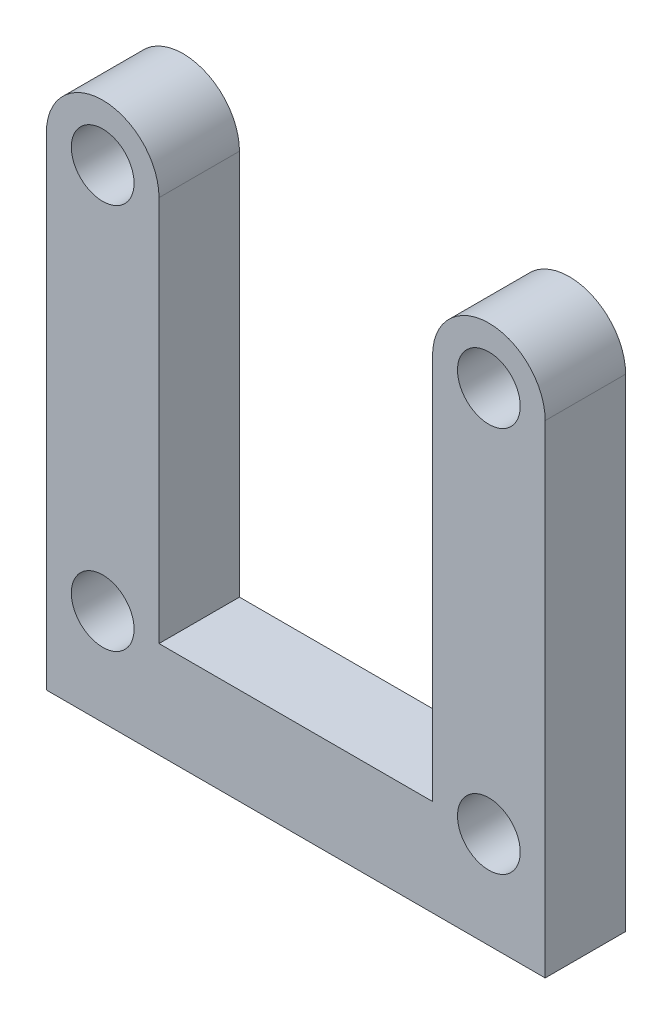
ISO-10303-21;
HEADER;
FILE_DESCRIPTION(('STEP AP214'),'2;1');
FILE_NAME('part.step','',(''),(''),'','','');
FILE_SCHEMA(('AUTOMOTIVE_DESIGN { 1 0 10303 214 1 1 1 1 }'));
ENDSEC;
DATA;
#1=APPLICATION_CONTEXT('core data for automotive mechanical design processes');
#2=APPLICATION_PROTOCOL_DEFINITION('international standard','automotive_design',2000,#1);
#3=PRODUCT_CONTEXT('',#1,'mechanical');
#4=PRODUCT('Part','Part','',(#3));
#5=PRODUCT_RELATED_PRODUCT_CATEGORY('part','',(#4));
#6=PRODUCT_DEFINITION_FORMATION('','',#4);
#7=PRODUCT_DEFINITION_CONTEXT('part definition',#1,'design');
#8=PRODUCT_DEFINITION('design','',#6,#7);
#9=PRODUCT_DEFINITION_SHAPE('','',#8);
#10=(LENGTH_UNIT() NAMED_UNIT(*) SI_UNIT(.MILLI.,.METRE.));
#11=(NAMED_UNIT(*) PLANE_ANGLE_UNIT() SI_UNIT($,.RADIAN.));
#12=(NAMED_UNIT(*) SI_UNIT($,.STERADIAN.) SOLID_ANGLE_UNIT());
#13=UNCERTAINTY_MEASURE_WITH_UNIT(LENGTH_MEASURE(1.E-05),#10,'distance_accuracy_value','');
#14=(GEOMETRIC_REPRESENTATION_CONTEXT(3) GLOBAL_UNCERTAINTY_ASSIGNED_CONTEXT((#13)) GLOBAL_UNIT_ASSIGNED_CONTEXT((#10,
#11,#12)) REPRESENTATION_CONTEXT('',''));
#15=CARTESIAN_POINT('',(0.,0.,0.));
#16=DIRECTION('',(0.,0.,1.));
#17=DIRECTION('',(1.,0.,0.));
#18=AXIS2_PLACEMENT_3D('',#15,#16,#17);
#19=CARTESIAN_POINT('',(15.5,0.,5.));
#20=DIRECTION('',(1.,0.,0.));
#21=DIRECTION('',(0.,1.,0.));
#22=AXIS2_PLACEMENT_3D('',#19,#20,#21);
#23=PLANE('',#22);
#24=DIRECTION('',(0.,-1.,0.));
#25=VECTOR('',#24,1.);
#26=CARTESIAN_POINT('',(15.5,0.,0.));
#27=LINE('',#26,#25);
#28=CARTESIAN_POINT('',(15.5,12.,0.));
#29=VERTEX_POINT('',#28);
#30=CARTESIAN_POINT('',(15.5,-18.,0.));
#31=VERTEX_POINT('',#30);
#32=EDGE_CURVE('E155',#29,#31,#27,.T.);
#33=ORIENTED_EDGE('',*,*,#32,.F.);
#34=DIRECTION('',(0.,0.,-1.));
#35=VECTOR('',#34,1.);
#36=CARTESIAN_POINT('',(15.5,12.,5.));
#37=LINE('',#36,#35);
#38=CARTESIAN_POINT('',(15.5,12.,5.));
#39=VERTEX_POINT('',#38);
#40=EDGE_CURVE('E11',#39,#29,#37,.T.);
#41=ORIENTED_EDGE('',*,*,#40,.F.);
#42=DIRECTION('',(0.,-1.,0.));
#43=VECTOR('',#42,1.);
#44=CARTESIAN_POINT('',(15.5,0.,5.));
#45=LINE('',#44,#43);
#46=CARTESIAN_POINT('',(15.5,-18.,5.));
#47=VERTEX_POINT('',#46);
#48=EDGE_CURVE('E272',#39,#47,#45,.T.);
#49=ORIENTED_EDGE('',*,*,#48,.T.);
#50=DIRECTION('',(0.,0.,-1.));
#51=VECTOR('',#50,1.);
#52=CARTESIAN_POINT('',(15.5,-18.,5.));
#53=LINE('',#52,#51);
#54=EDGE_CURVE('E57',#47,#31,#53,.T.);
#55=ORIENTED_EDGE('',*,*,#54,.T.);
#56=EDGE_LOOP('',(#33,#41,#49,#55));
#57=FACE_BOUND('',#56,.T.);
#58=ADVANCED_FACE('F40',(#57),#23,.T.);
#59=CARTESIAN_POINT('',(12.,12.,5.));
#60=DIRECTION('',(0.,0.,-1.));
#61=DIRECTION('',(-1.,0.,0.));
#62=AXIS2_PLACEMENT_3D('',#59,#60,#61);
#63=CYLINDRICAL_SURFACE('',#62,3.5);
#64=CARTESIAN_POINT('',(12.,12.,0.));
#65=DIRECTION('',(0.,0.,1.));
#66=DIRECTION('',(1.,0.,0.));
#67=AXIS2_PLACEMENT_3D('',#64,#65,#66);
#68=CIRCLE('',#67,3.5);
#69=CARTESIAN_POINT('',(8.5,12.,0.));
#70=VERTEX_POINT('',#69);
#71=EDGE_CURVE('E152',#29,#70,#68,.T.);
#72=ORIENTED_EDGE('',*,*,#71,.T.);
#73=DIRECTION('',(0.,0.,-1.));
#74=VECTOR('',#73,1.);
#75=CARTESIAN_POINT('',(8.5,12.,5.));
#76=LINE('',#75,#74);
#77=CARTESIAN_POINT('',(8.5,12.,5.));
#78=VERTEX_POINT('',#77);
#79=EDGE_CURVE('E49',#78,#70,#76,.T.);
#80=ORIENTED_EDGE('',*,*,#79,.F.);
#81=CARTESIAN_POINT('',(12.,12.,5.));
#82=DIRECTION('',(0.,0.,1.));
#83=DIRECTION('',(1.,0.,0.));
#84=AXIS2_PLACEMENT_3D('',#81,#82,#83);
#85=CIRCLE('',#84,3.5);
#86=EDGE_CURVE('E274',#39,#78,#85,.T.);
#87=ORIENTED_EDGE('',*,*,#86,.F.);
#88=ORIENTED_EDGE('',*,*,#40,.T.);
#89=EDGE_LOOP('',(#72,#80,#87,#88));
#90=FACE_BOUND('',#89,.T.);
#91=ADVANCED_FACE('F153',(#90),#63,.T.);
#92=CARTESIAN_POINT('',(8.5,0.,5.));
#93=DIRECTION('',(1.,0.,0.));
#94=DIRECTION('',(0.,1.,0.));
#95=AXIS2_PLACEMENT_3D('',#92,#93,#94);
#96=PLANE('',#95);
#97=DIRECTION('',(0.,-1.,0.));
#98=VECTOR('',#97,1.);
#99=CARTESIAN_POINT('',(8.5,0.,0.));
#100=LINE('',#99,#98);
#101=CARTESIAN_POINT('',(8.5,-12.,0.));
#102=VERTEX_POINT('',#101);
#103=EDGE_CURVE('E146',#70,#102,#100,.T.);
#104=ORIENTED_EDGE('',*,*,#103,.T.);
#105=DIRECTION('',(0.,0.,-1.));
#106=VECTOR('',#105,1.);
#107=CARTESIAN_POINT('',(8.5,-12.,5.));
#108=LINE('',#107,#106);
#109=CARTESIAN_POINT('',(8.5,-12.,5.));
#110=VERTEX_POINT('',#109);
#111=EDGE_CURVE('E138',#110,#102,#108,.T.);
#112=ORIENTED_EDGE('',*,*,#111,.F.);
#113=DIRECTION('',(0.,-1.,0.));
#114=VECTOR('',#113,1.);
#115=CARTESIAN_POINT('',(8.5,0.,5.));
#116=LINE('',#115,#114);
#117=EDGE_CURVE('E148',#78,#110,#116,.T.);
#118=ORIENTED_EDGE('',*,*,#117,.F.);
#119=ORIENTED_EDGE('',*,*,#79,.T.);
#120=EDGE_LOOP('',(#104,#112,#118,#119));
#121=FACE_BOUND('',#120,.T.);
#122=ADVANCED_FACE('F144',(#121),#96,.F.);
#123=CARTESIAN_POINT('',(0.,-12.,5.));
#124=DIRECTION('',(0.,1.,0.));
#125=DIRECTION('',(-1.,0.,0.));
#126=AXIS2_PLACEMENT_3D('',#123,#124,#125);
#127=PLANE('',#126);
#128=DIRECTION('',(1.,0.,0.));
#129=VECTOR('',#128,1.);
#130=CARTESIAN_POINT('',(0.,-12.,0.));
#131=LINE('',#130,#129);
#132=CARTESIAN_POINT('',(-8.5,-12.,0.));
#133=VERTEX_POINT('',#132);
#134=EDGE_CURVE('E157',#133,#102,#131,.T.);
#135=ORIENTED_EDGE('',*,*,#134,.F.);
#136=DIRECTION('',(0.,0.,-1.));
#137=VECTOR('',#136,1.);
#138=CARTESIAN_POINT('',(-8.5,-12.,5.));
#139=LINE('',#138,#137);
#140=CARTESIAN_POINT('',(-8.5,-12.,5.));
#141=VERTEX_POINT('',#140);
#142=EDGE_CURVE('E132',#141,#133,#139,.T.);
#143=ORIENTED_EDGE('',*,*,#142,.F.);
#144=DIRECTION('',(1.,0.,0.));
#145=VECTOR('',#144,1.);
#146=CARTESIAN_POINT('',(0.,-12.,5.));
#147=LINE('',#146,#145);
#148=EDGE_CURVE('E277',#141,#110,#147,.T.);
#149=ORIENTED_EDGE('',*,*,#148,.T.);
#150=ORIENTED_EDGE('',*,*,#111,.T.);
#151=EDGE_LOOP('',(#135,#143,#149,#150));
#152=FACE_BOUND('',#151,.T.);
#153=ADVANCED_FACE('F212',(#152),#127,.T.);
#154=CARTESIAN_POINT('',(-8.5,0.,5.));
#155=DIRECTION('',(1.,0.,0.));
#156=DIRECTION('',(0.,1.,0.));
#157=AXIS2_PLACEMENT_3D('',#154,#155,#156);
#158=PLANE('',#157);
#159=DIRECTION('',(0.,-1.,0.));
#160=VECTOR('',#159,1.);
#161=CARTESIAN_POINT('',(-8.5,0.,0.));
#162=LINE('',#161,#160);
#163=CARTESIAN_POINT('',(-8.5,12.,0.));
#164=VERTEX_POINT('',#163);
#165=EDGE_CURVE('E164',#164,#133,#162,.T.);
#166=ORIENTED_EDGE('',*,*,#165,.F.);
#167=DIRECTION('',(0.,0.,-1.));
#168=VECTOR('',#167,1.);
#169=CARTESIAN_POINT('',(-8.5,12.,5.));
#170=LINE('',#169,#168);
#171=CARTESIAN_POINT('',(-8.5,12.,5.));
#172=VERTEX_POINT('',#171);
#173=EDGE_CURVE('E130',#172,#164,#170,.T.);
#174=ORIENTED_EDGE('',*,*,#173,.F.);
#175=DIRECTION('',(0.,-1.,0.));
#176=VECTOR('',#175,1.);
#177=CARTESIAN_POINT('',(-8.5,0.,5.));
#178=LINE('',#177,#176);
#179=EDGE_CURVE('E124',#172,#141,#178,.T.);
#180=ORIENTED_EDGE('',*,*,#179,.T.);
#181=ORIENTED_EDGE('',*,*,#142,.T.);
#182=EDGE_LOOP('',(#166,#174,#180,#181));
#183=FACE_BOUND('',#182,.T.);
#184=ADVANCED_FACE('F215',(#183),#158,.T.);
#185=CARTESIAN_POINT('',(-12.,12.,5.));
#186=DIRECTION('',(0.,0.,-1.));
#187=DIRECTION('',(-1.,0.,0.));
#188=AXIS2_PLACEMENT_3D('',#185,#186,#187);
#189=CYLINDRICAL_SURFACE('',#188,3.5);
#190=CARTESIAN_POINT('',(-12.,12.,0.));
#191=DIRECTION('',(0.,0.,1.));
#192=DIRECTION('',(1.,0.,0.));
#193=AXIS2_PLACEMENT_3D('',#190,#191,#192);
#194=CIRCLE('',#193,3.5);
#195=CARTESIAN_POINT('',(-15.5,12.,0.));
#196=VERTEX_POINT('',#195);
#197=EDGE_CURVE('E129',#164,#196,#194,.T.);
#198=ORIENTED_EDGE('',*,*,#197,.T.);
#199=DIRECTION('',(0.,0.,-1.));
#200=VECTOR('',#199,1.);
#201=CARTESIAN_POINT('',(-15.5,12.,5.));
#202=LINE('',#201,#200);
#203=CARTESIAN_POINT('',(-15.5,12.,5.));
#204=VERTEX_POINT('',#203);
#205=EDGE_CURVE('E111',#204,#196,#202,.T.);
#206=ORIENTED_EDGE('',*,*,#205,.F.);
#207=CARTESIAN_POINT('',(-12.,12.,5.));
#208=DIRECTION('',(0.,0.,1.));
#209=DIRECTION('',(1.,0.,0.));
#210=AXIS2_PLACEMENT_3D('',#207,#208,#209);
#211=CIRCLE('',#210,3.5);
#212=EDGE_CURVE('E116',#172,#204,#211,.T.);
#213=ORIENTED_EDGE('',*,*,#212,.F.);
#214=ORIENTED_EDGE('',*,*,#173,.T.);
#215=EDGE_LOOP('',(#198,#206,#213,#214));
#216=FACE_BOUND('',#215,.T.);
#217=ADVANCED_FACE('F127',(#216),#189,.T.);
#218=CARTESIAN_POINT('',(-15.5,0.,5.));
#219=DIRECTION('',(1.,0.,0.));
#220=DIRECTION('',(0.,1.,0.));
#221=AXIS2_PLACEMENT_3D('',#218,#219,#220);
#222=PLANE('',#221);
#223=DIRECTION('',(0.,-1.,0.));
#224=VECTOR('',#223,1.);
#225=CARTESIAN_POINT('',(-15.5,0.,0.));
#226=LINE('',#225,#224);
#227=CARTESIAN_POINT('',(-15.5,-18.,0.));
#228=VERTEX_POINT('',#227);
#229=EDGE_CURVE('E168',#196,#228,#226,.T.);
#230=ORIENTED_EDGE('',*,*,#229,.T.);
#231=DIRECTION('',(0.,0.,-1.));
#232=VECTOR('',#231,1.);
#233=CARTESIAN_POINT('',(-15.5,-18.,5.));
#234=LINE('',#233,#232);
#235=CARTESIAN_POINT('',(-15.5,-18.,5.));
#236=VERTEX_POINT('',#235);
#237=EDGE_CURVE('E83',#236,#228,#234,.T.);
#238=ORIENTED_EDGE('',*,*,#237,.F.);
#239=DIRECTION('',(0.,-1.,0.));
#240=VECTOR('',#239,1.);
#241=CARTESIAN_POINT('',(-15.5,0.,5.));
#242=LINE('',#241,#240);
#243=EDGE_CURVE('E107',#204,#236,#242,.T.);
#244=ORIENTED_EDGE('',*,*,#243,.F.);
#245=ORIENTED_EDGE('',*,*,#205,.T.);
#246=EDGE_LOOP('',(#230,#238,#244,#245));
#247=FACE_BOUND('',#246,.T.);
#248=ADVANCED_FACE('F109',(#247),#222,.F.);
#249=CARTESIAN_POINT('',(12.,-12.,5.));
#250=DIRECTION('',(0.,0.,-1.));
#251=DIRECTION('',(-1.,0.,0.));
#252=AXIS2_PLACEMENT_3D('',#249,#250,#251);
#253=CYLINDRICAL_SURFACE('',#252,1.95);
#254=CARTESIAN_POINT('',(12.,-12.,5.));
#255=DIRECTION('',(0.,0.,1.));
#256=DIRECTION('',(1.,0.,0.));
#257=AXIS2_PLACEMENT_3D('',#254,#255,#256);
#258=CIRCLE('',#257,1.95);
#259=CARTESIAN_POINT('',(13.95,-12.,5.));
#260=VERTEX_POINT('',#259);
#261=EDGE_CURVE('E270',#260,#260,#258,.T.);
#262=ORIENTED_EDGE('',*,*,#261,.T.);
#263=EDGE_LOOP('',(#262));
#264=FACE_BOUND('',#263,.T.);
#265=CARTESIAN_POINT('',(12.,-12.,0.));
#266=DIRECTION('',(0.,0.,1.));
#267=DIRECTION('',(1.,0.,0.));
#268=AXIS2_PLACEMENT_3D('',#265,#266,#267);
#269=CIRCLE('',#268,1.95);
#270=CARTESIAN_POINT('',(13.95,-12.,0.));
#271=VERTEX_POINT('',#270);
#272=EDGE_CURVE('E159',#271,#271,#269,.T.);
#273=ORIENTED_EDGE('',*,*,#272,.F.);
#274=EDGE_LOOP('',(#273));
#275=FACE_BOUND('',#274,.T.);
#276=ADVANCED_FACE('F189',(#264,#275),#253,.F.);
#277=CARTESIAN_POINT('',(12.,12.,5.));
#278=DIRECTION('',(0.,0.,-1.));
#279=DIRECTION('',(-1.,0.,0.));
#280=AXIS2_PLACEMENT_3D('',#277,#278,#279);
#281=CYLINDRICAL_SURFACE('',#280,1.95);
#282=CARTESIAN_POINT('',(12.,12.,5.));
#283=DIRECTION('',(0.,0.,1.));
#284=DIRECTION('',(1.,0.,0.));
#285=AXIS2_PLACEMENT_3D('',#282,#283,#284);
#286=CIRCLE('',#285,1.95);
#287=CARTESIAN_POINT('',(13.95,12.,5.));
#288=VERTEX_POINT('',#287);
#289=EDGE_CURVE('E267',#288,#288,#286,.T.);
#290=ORIENTED_EDGE('',*,*,#289,.T.);
#291=EDGE_LOOP('',(#290));
#292=FACE_BOUND('',#291,.T.);
#293=CARTESIAN_POINT('',(12.,12.,0.));
#294=DIRECTION('',(0.,0.,1.));
#295=DIRECTION('',(1.,0.,0.));
#296=AXIS2_PLACEMENT_3D('',#293,#294,#295);
#297=CIRCLE('',#296,1.95);
#298=CARTESIAN_POINT('',(13.95,12.,0.));
#299=VERTEX_POINT('',#298);
#300=EDGE_CURVE('E182',#299,#299,#297,.T.);
#301=ORIENTED_EDGE('',*,*,#300,.F.);
#302=EDGE_LOOP('',(#301));
#303=FACE_BOUND('',#302,.T.);
#304=ADVANCED_FACE('F191',(#292,#303),#281,.F.);
#305=CARTESIAN_POINT('',(-12.,12.,5.));
#306=DIRECTION('',(0.,0.,-1.));
#307=DIRECTION('',(-1.,0.,0.));
#308=AXIS2_PLACEMENT_3D('',#305,#306,#307);
#309=CYLINDRICAL_SURFACE('',#308,1.95);
#310=CARTESIAN_POINT('',(-12.,12.,5.));
#311=DIRECTION('',(0.,0.,1.));
#312=DIRECTION('',(1.,0.,0.));
#313=AXIS2_PLACEMENT_3D('',#310,#311,#312);
#314=CIRCLE('',#313,1.95);
#315=CARTESIAN_POINT('',(-10.05,12.,5.));
#316=VERTEX_POINT('',#315);
#317=EDGE_CURVE('E264',#316,#316,#314,.T.);
#318=ORIENTED_EDGE('',*,*,#317,.T.);
#319=EDGE_LOOP('',(#318));
#320=FACE_BOUND('',#319,.T.);
#321=CARTESIAN_POINT('',(-12.,12.,0.));
#322=DIRECTION('',(0.,0.,1.));
#323=DIRECTION('',(1.,0.,0.));
#324=AXIS2_PLACEMENT_3D('',#321,#322,#323);
#325=CIRCLE('',#324,1.95);
#326=CARTESIAN_POINT('',(-10.05,12.,0.));
#327=VERTEX_POINT('',#326);
#328=EDGE_CURVE('E178',#327,#327,#325,.T.);
#329=ORIENTED_EDGE('',*,*,#328,.F.);
#330=EDGE_LOOP('',(#329));
#331=FACE_BOUND('',#330,.T.);
#332=ADVANCED_FACE('F198',(#320,#331),#309,.F.);
#333=CARTESIAN_POINT('',(-12.,-12.,5.));
#334=DIRECTION('',(0.,0.,-1.));
#335=DIRECTION('',(-1.,0.,0.));
#336=AXIS2_PLACEMENT_3D('',#333,#334,#335);
#337=CYLINDRICAL_SURFACE('',#336,1.95);
#338=CARTESIAN_POINT('',(-12.,-12.,5.));
#339=DIRECTION('',(0.,0.,1.));
#340=DIRECTION('',(1.,0.,0.));
#341=AXIS2_PLACEMENT_3D('',#338,#339,#340);
#342=CIRCLE('',#341,1.95);
#343=CARTESIAN_POINT('',(-10.05,-12.,5.));
#344=VERTEX_POINT('',#343);
#345=EDGE_CURVE('E172',#344,#344,#342,.T.);
#346=ORIENTED_EDGE('',*,*,#345,.T.);
#347=EDGE_LOOP('',(#346));
#348=FACE_BOUND('',#347,.T.);
#349=CARTESIAN_POINT('',(-12.,-12.,0.));
#350=DIRECTION('',(0.,0.,1.));
#351=DIRECTION('',(1.,0.,0.));
#352=AXIS2_PLACEMENT_3D('',#349,#350,#351);
#353=CIRCLE('',#352,1.95);
#354=CARTESIAN_POINT('',(-10.05,-12.,0.));
#355=VERTEX_POINT('',#354);
#356=EDGE_CURVE('E175',#355,#355,#353,.T.);
#357=ORIENTED_EDGE('',*,*,#356,.F.);
#358=EDGE_LOOP('',(#357));
#359=FACE_BOUND('',#358,.T.);
#360=ADVANCED_FACE('F42',(#348,#359),#337,.F.);
#361=CARTESIAN_POINT('',(0.,-18.,5.));
#362=DIRECTION('',(0.,-1.,0.));
#363=DIRECTION('',(0.,0.,-1.));
#364=AXIS2_PLACEMENT_3D('',#361,#362,#363);
#365=PLANE('',#364);
#366=CARTESIAN_POINT('',(-8.,-18.,2.5));
#367=DIRECTION('',(0.,-1.,0.));
#368=DIRECTION('',(0.,0.,-1.));
#369=AXIS2_PLACEMENT_3D('',#366,#367,#368);
#370=CIRCLE('',#369,1.25);
#371=CARTESIAN_POINT('',(-8.,-18.,1.25));
#372=VERTEX_POINT('',#371);
#373=EDGE_CURVE('E251',#372,#372,#370,.T.);
#374=ORIENTED_EDGE('',*,*,#373,.F.);
#375=EDGE_LOOP('',(#374));
#376=FACE_BOUND('',#375,.T.);
#377=CARTESIAN_POINT('',(8.,-18.,2.5));
#378=DIRECTION('',(0.,-1.,0.));
#379=DIRECTION('',(0.,0.,-1.));
#380=AXIS2_PLACEMENT_3D('',#377,#378,#379);
#381=CIRCLE('',#380,1.25);
#382=CARTESIAN_POINT('',(8.,-18.,1.25));
#383=VERTEX_POINT('',#382);
#384=EDGE_CURVE('E254',#383,#383,#381,.T.);
#385=ORIENTED_EDGE('',*,*,#384,.F.);
#386=EDGE_LOOP('',(#385));
#387=FACE_BOUND('',#386,.T.);
#388=DIRECTION('',(-1.,0.,0.));
#389=VECTOR('',#388,1.);
#390=CARTESIAN_POINT('',(0.,-18.,0.));
#391=LINE('',#390,#389);
#392=EDGE_CURVE('E170',#31,#228,#391,.T.);
#393=ORIENTED_EDGE('',*,*,#392,.F.);
#394=ORIENTED_EDGE('',*,*,#54,.F.);
#395=DIRECTION('',(-1.,0.,0.));
#396=VECTOR('',#395,1.);
#397=CARTESIAN_POINT('',(0.,-18.,5.));
#398=LINE('',#397,#396);
#399=EDGE_CURVE('E115',#47,#236,#398,.T.);
#400=ORIENTED_EDGE('',*,*,#399,.T.);
#401=ORIENTED_EDGE('',*,*,#237,.T.);
#402=EDGE_LOOP('',(#393,#394,#400,#401));
#403=FACE_BOUND('',#402,.T.);
#404=ADVANCED_FACE('F222',(#376,#387,#403),#365,.T.);
#405=CARTESIAN_POINT('',(0.,0.,5.));
#406=DIRECTION('',(0.,0.,1.));
#407=DIRECTION('',(1.,0.,0.));
#408=AXIS2_PLACEMENT_3D('',#405,#406,#407);
#409=PLANE('',#408);
#410=ORIENTED_EDGE('',*,*,#345,.F.);
#411=EDGE_LOOP('',(#410));
#412=FACE_BOUND('',#411,.T.);
#413=ORIENTED_EDGE('',*,*,#317,.F.);
#414=EDGE_LOOP('',(#413));
#415=FACE_BOUND('',#414,.T.);
#416=ORIENTED_EDGE('',*,*,#289,.F.);
#417=EDGE_LOOP('',(#416));
#418=FACE_BOUND('',#417,.T.);
#419=ORIENTED_EDGE('',*,*,#261,.F.);
#420=EDGE_LOOP('',(#419));
#421=FACE_BOUND('',#420,.T.);
#422=ORIENTED_EDGE('',*,*,#48,.F.);
#423=ORIENTED_EDGE('',*,*,#86,.T.);
#424=ORIENTED_EDGE('',*,*,#117,.T.);
#425=ORIENTED_EDGE('',*,*,#148,.F.);
#426=ORIENTED_EDGE('',*,*,#179,.F.);
#427=ORIENTED_EDGE('',*,*,#212,.T.);
#428=ORIENTED_EDGE('',*,*,#243,.T.);
#429=ORIENTED_EDGE('',*,*,#399,.F.);
#430=EDGE_LOOP('',(#422,#423,#424,#425,#426,#427,#428,#429));
#431=FACE_BOUND('',#430,.T.);
#432=ADVANCED_FACE('F121',(#412,#415,#418,#421,#431),#409,.T.);
#433=CARTESIAN_POINT('',(0.,0.,0.));
#434=DIRECTION('',(0.,0.,1.));
#435=DIRECTION('',(1.,0.,0.));
#436=AXIS2_PLACEMENT_3D('',#433,#434,#435);
#437=PLANE('',#436);
#438=ORIENTED_EDGE('',*,*,#356,.T.);
#439=EDGE_LOOP('',(#438));
#440=FACE_BOUND('',#439,.T.);
#441=ORIENTED_EDGE('',*,*,#328,.T.);
#442=EDGE_LOOP('',(#441));
#443=FACE_BOUND('',#442,.T.);
#444=ORIENTED_EDGE('',*,*,#300,.T.);
#445=EDGE_LOOP('',(#444));
#446=FACE_BOUND('',#445,.T.);
#447=ORIENTED_EDGE('',*,*,#272,.T.);
#448=EDGE_LOOP('',(#447));
#449=FACE_BOUND('',#448,.T.);
#450=ORIENTED_EDGE('',*,*,#32,.T.);
#451=ORIENTED_EDGE('',*,*,#392,.T.);
#452=ORIENTED_EDGE('',*,*,#229,.F.);
#453=ORIENTED_EDGE('',*,*,#197,.F.);
#454=ORIENTED_EDGE('',*,*,#165,.T.);
#455=ORIENTED_EDGE('',*,*,#134,.T.);
#456=ORIENTED_EDGE('',*,*,#103,.F.);
#457=ORIENTED_EDGE('',*,*,#71,.F.);
#458=EDGE_LOOP('',(#450,#451,#452,#453,#454,#455,#456,#457));
#459=FACE_BOUND('',#458,.T.);
#460=ADVANCED_FACE('F187',(#440,#443,#446,#449,#459),#437,.F.);
#461=CARTESIAN_POINT('',(8.,-12.5,2.5));
#462=DIRECTION('',(0.,-1.,0.));
#463=DIRECTION('',(0.,0.,-1.));
#464=AXIS2_PLACEMENT_3D('',#461,#462,#463);
#465=CYLINDRICAL_SURFACE('',#464,1.25);
#466=CARTESIAN_POINT('',(8.,-12.5,2.5));
#467=DIRECTION('',(0.,-1.,0.));
#468=DIRECTION('',(0.,0.,-1.));
#469=AXIS2_PLACEMENT_3D('',#466,#467,#468);
#470=CIRCLE('',#469,1.25);
#471=CARTESIAN_POINT('',(8.,-12.5,1.25));
#472=VERTEX_POINT('',#471);
#473=EDGE_CURVE('E259',#472,#472,#470,.T.);
#474=ORIENTED_EDGE('',*,*,#473,.F.);
#475=EDGE_LOOP('',(#474));
#476=FACE_BOUND('',#475,.T.);
#477=ORIENTED_EDGE('',*,*,#384,.T.);
#478=EDGE_LOOP('',(#477));
#479=FACE_BOUND('',#478,.T.);
#480=ADVANCED_FACE('F228',(#476,#479),#465,.F.);
#481=CARTESIAN_POINT('',(8.,-12.5,2.5));
#482=DIRECTION('',(0.,-1.,0.));
#483=DIRECTION('',(0.,0.,-1.));
#484=AXIS2_PLACEMENT_3D('',#481,#482,#483);
#485=PLANE('',#484);
#486=ORIENTED_EDGE('',*,*,#473,.T.);
#487=EDGE_LOOP('',(#486));
#488=FACE_BOUND('',#487,.T.);
#489=ADVANCED_FACE('F233',(#488),#485,.T.);
#490=CARTESIAN_POINT('',(-8.,-12.5,2.5));
#491=DIRECTION('',(0.,-1.,0.));
#492=DIRECTION('',(0.,0.,-1.));
#493=AXIS2_PLACEMENT_3D('',#490,#491,#492);
#494=CYLINDRICAL_SURFACE('',#493,1.25);
#495=CARTESIAN_POINT('',(-8.,-12.5,2.5));
#496=DIRECTION('',(0.,-1.,0.));
#497=DIRECTION('',(0.,0.,-1.));
#498=AXIS2_PLACEMENT_3D('',#495,#496,#497);
#499=CIRCLE('',#498,1.25);
#500=CARTESIAN_POINT('',(-8.,-12.5,1.25));
#501=VERTEX_POINT('',#500);
#502=EDGE_CURVE('E179',#501,#501,#499,.T.);
#503=ORIENTED_EDGE('',*,*,#502,.F.);
#504=EDGE_LOOP('',(#503));
#505=FACE_BOUND('',#504,.T.);
#506=ORIENTED_EDGE('',*,*,#373,.T.);
#507=EDGE_LOOP('',(#506));
#508=FACE_BOUND('',#507,.T.);
#509=ADVANCED_FACE('F236',(#505,#508),#494,.F.);
#510=CARTESIAN_POINT('',(-8.,-12.5,2.5));
#511=DIRECTION('',(0.,-1.,0.));
#512=DIRECTION('',(0.,0.,-1.));
#513=AXIS2_PLACEMENT_3D('',#510,#511,#512);
#514=PLANE('',#513);
#515=ORIENTED_EDGE('',*,*,#502,.T.);
#516=EDGE_LOOP('',(#515));
#517=FACE_BOUND('',#516,.T.);
#518=ADVANCED_FACE('F243',(#517),#514,.T.);
#519=CLOSED_SHELL('',(#58,#91,#122,#153,#184,#217,#248,#276,#304,#332,#360,#404,#432,#460,#480,
#489,#509,#518));
#520=MANIFOLD_SOLID_BREP('B2',#519);
#521=ADVANCED_BREP_SHAPE_REPRESENTATION('',(#18,#520),#14);
#522=SHAPE_DEFINITION_REPRESENTATION(#9,#521);
ENDSEC;
END-ISO-10303-21;
